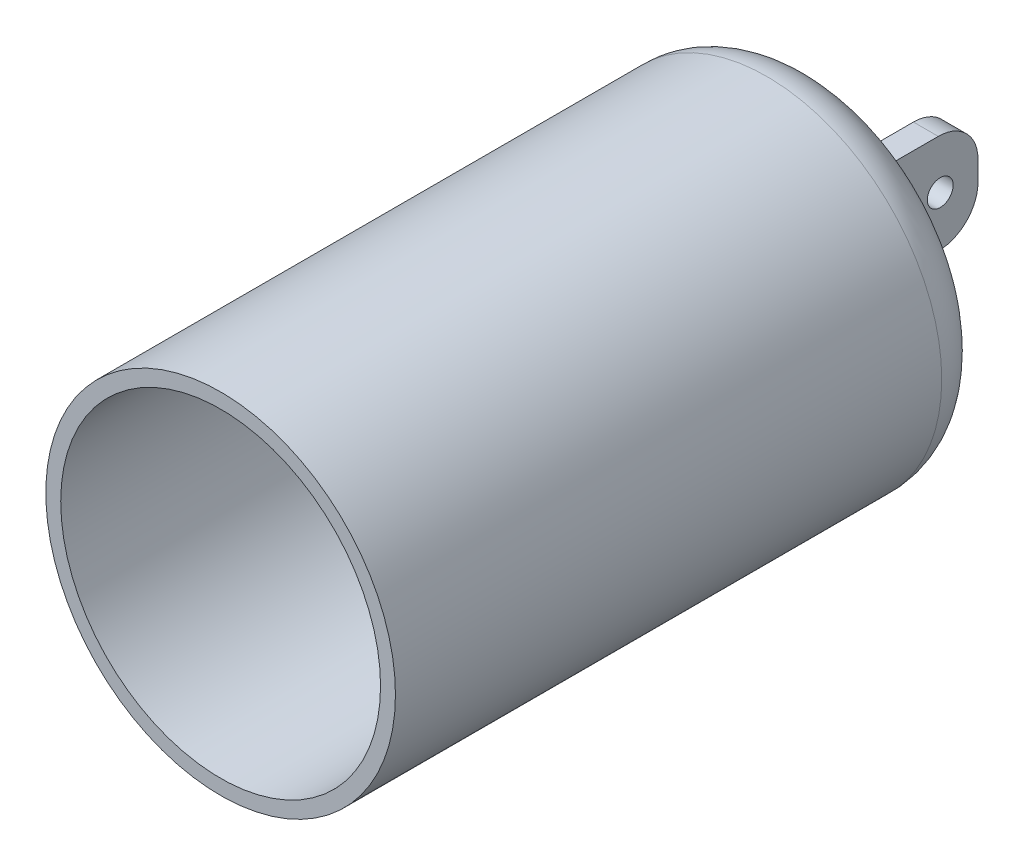
ISO-10303-21;
HEADER;
FILE_DESCRIPTION(('STEP AP214'),'2;1');
FILE_NAME('part.step','',(''),(''),'','','');
FILE_SCHEMA(('AUTOMOTIVE_DESIGN { 1 0 10303 214 1 1 1 1 }'));
ENDSEC;
DATA;
#1=APPLICATION_CONTEXT('core data for automotive mechanical design processes');
#2=APPLICATION_PROTOCOL_DEFINITION('international standard','automotive_design',2000,#1);
#3=PRODUCT_CONTEXT('',#1,'mechanical');
#4=PRODUCT('Part','Part','',(#3));
#5=PRODUCT_RELATED_PRODUCT_CATEGORY('part','',(#4));
#6=PRODUCT_DEFINITION_FORMATION('','',#4);
#7=PRODUCT_DEFINITION_CONTEXT('part definition',#1,'design');
#8=PRODUCT_DEFINITION('design','',#6,#7);
#9=PRODUCT_DEFINITION_SHAPE('','',#8);
#10=(LENGTH_UNIT() NAMED_UNIT(*) SI_UNIT(.MILLI.,.METRE.));
#11=(NAMED_UNIT(*) PLANE_ANGLE_UNIT() SI_UNIT($,.RADIAN.));
#12=(NAMED_UNIT(*) SI_UNIT($,.STERADIAN.) SOLID_ANGLE_UNIT());
#13=UNCERTAINTY_MEASURE_WITH_UNIT(LENGTH_MEASURE(1.E-05),#10,'distance_accuracy_value','');
#14=(GEOMETRIC_REPRESENTATION_CONTEXT(3) GLOBAL_UNCERTAINTY_ASSIGNED_CONTEXT((#13)) GLOBAL_UNIT_ASSIGNED_CONTEXT((#10,
#11,#12)) REPRESENTATION_CONTEXT('',''));
#15=CARTESIAN_POINT('',(0.,0.,0.));
#16=DIRECTION('',(0.,0.,1.));
#17=DIRECTION('',(1.,0.,0.));
#18=AXIS2_PLACEMENT_3D('',#15,#16,#17);
#19=CARTESIAN_POINT('',(0.,0.,0.));
#20=DIRECTION('',(0.,0.,1.));
#21=DIRECTION('',(1.,0.,0.));
#22=AXIS2_PLACEMENT_3D('',#19,#20,#21);
#23=PLANE('',#22);
#24=CARTESIAN_POINT('',(0.,0.,0.));
#25=DIRECTION('',(0.,0.,1.));
#26=DIRECTION('',(1.,0.,0.));
#27=AXIS2_PLACEMENT_3D('',#24,#25,#26);
#28=CIRCLE('',#27,126.);
#29=CARTESIAN_POINT('',(126.,0.,0.));
#30=VERTEX_POINT('',#29);
#31=EDGE_CURVE('E11',#30,#30,#28,.F.);
#32=ORIENTED_EDGE('',*,*,#31,.T.);
#33=EDGE_LOOP('',(#32));
#34=FACE_BOUND('',#33,.T.);
#35=DIRECTION('',(1.,0.,0.));
#36=VECTOR('',#35,1.);
#37=CARTESIAN_POINT('',(-12.5,70.,0.));
#38=LINE('',#37,#36);
#39=CARTESIAN_POINT('',(32.5,70.,0.));
#40=VERTEX_POINT('',#39);
#41=CARTESIAN_POINT('',(-32.5,70.,0.));
#42=VERTEX_POINT('',#41);
#43=EDGE_CURVE('E213',#40,#42,#38,.F.);
#44=ORIENTED_EDGE('',*,*,#43,.T.);
#45=DIRECTION('',(0.,1.,0.));
#46=VECTOR('',#45,1.);
#47=CARTESIAN_POINT('',(-32.5,-50.,0.));
#48=LINE('',#47,#46);
#49=CARTESIAN_POINT('',(-32.5,-70.,0.));
#50=VERTEX_POINT('',#49);
#51=EDGE_CURVE('E219',#42,#50,#48,.F.);
#52=ORIENTED_EDGE('',*,*,#51,.T.);
#53=DIRECTION('',(-1.,0.,0.));
#54=VECTOR('',#53,1.);
#55=CARTESIAN_POINT('',(12.5,-70.,0.));
#56=LINE('',#55,#54);
#57=CARTESIAN_POINT('',(32.5,-70.,0.));
#58=VERTEX_POINT('',#57);
#59=EDGE_CURVE('E217',#50,#58,#56,.F.);
#60=ORIENTED_EDGE('',*,*,#59,.T.);
#61=DIRECTION('',(0.,-1.,0.));
#62=VECTOR('',#61,1.);
#63=CARTESIAN_POINT('',(32.5,50.,0.));
#64=LINE('',#63,#62);
#65=EDGE_CURVE('E215',#58,#40,#64,.F.);
#66=ORIENTED_EDGE('',*,*,#65,.T.);
#67=EDGE_LOOP('',(#44,#52,#60,#66));
#68=FACE_BOUND('',#67,.T.);
#69=ADVANCED_FACE('F39',(#34,#68),#23,.F.);
#70=CARTESIAN_POINT('',(0.,0.,600.));
#71=DIRECTION('',(0.,0.,-1.));
#72=DIRECTION('',(-1.,0.,0.));
#73=AXIS2_PLACEMENT_3D('',#70,#71,#72);
#74=CYLINDRICAL_SURFACE('',#73,176.);
#75=CARTESIAN_POINT('',(0.,0.,50.));
#76=DIRECTION('',(0.,0.,1.));
#77=DIRECTION('',(1.,0.,0.));
#78=AXIS2_PLACEMENT_3D('',#75,#76,#77);
#79=CIRCLE('',#78,176.);
#80=CARTESIAN_POINT('',(176.,0.,50.));
#81=VERTEX_POINT('',#80);
#82=EDGE_CURVE('E47',#81,#81,#79,.T.);
#83=ORIENTED_EDGE('',*,*,#82,.T.);
#84=EDGE_LOOP('',(#83));
#85=FACE_BOUND('',#84,.T.);
#86=CARTESIAN_POINT('',(0.,0.,600.));
#87=DIRECTION('',(0.,0.,1.));
#88=DIRECTION('',(1.,0.,0.));
#89=AXIS2_PLACEMENT_3D('',#86,#87,#88);
#90=CIRCLE('',#89,176.);
#91=CARTESIAN_POINT('',(176.,0.,600.));
#92=VERTEX_POINT('',#91);
#93=EDGE_CURVE('E187',#92,#92,#90,.T.);
#94=ORIENTED_EDGE('',*,*,#93,.F.);
#95=EDGE_LOOP('',(#94));
#96=FACE_BOUND('',#95,.T.);
#97=ADVANCED_FACE('F236',(#85,#96),#74,.T.);
#98=CARTESIAN_POINT('',(0.,0.,600.));
#99=DIRECTION('',(0.,0.,1.));
#100=DIRECTION('',(1.,0.,0.));
#101=AXIS2_PLACEMENT_3D('',#98,#99,#100);
#102=PLANE('',#101);
#103=CARTESIAN_POINT('',(0.,0.,600.));
#104=DIRECTION('',(0.,0.,1.));
#105=DIRECTION('',(1.,0.,0.));
#106=AXIS2_PLACEMENT_3D('',#103,#104,#105);
#107=CIRCLE('',#106,161.);
#108=CARTESIAN_POINT('',(161.,0.,600.));
#109=VERTEX_POINT('',#108);
#110=EDGE_CURVE('E144',#109,#109,#107,.T.);
#111=ORIENTED_EDGE('',*,*,#110,.F.);
#112=EDGE_LOOP('',(#111));
#113=FACE_BOUND('',#112,.T.);
#114=ORIENTED_EDGE('',*,*,#93,.T.);
#115=EDGE_LOOP('',(#114));
#116=FACE_BOUND('',#115,.T.);
#117=ADVANCED_FACE('F259',(#113,#116),#102,.T.);
#118=CARTESIAN_POINT('',(12.5,-50.,-150.));
#119=DIRECTION('',(-1.,0.,0.));
#120=DIRECTION('',(0.,0.,1.));
#121=AXIS2_PLACEMENT_3D('',#118,#119,#120);
#122=PLANE('',#121);
#123=CARTESIAN_POINT('',(12.5,0.,-112.));
#124=DIRECTION('',(1.,0.,0.));
#125=DIRECTION('',(0.,0.,-1.));
#126=AXIS2_PLACEMENT_3D('',#123,#124,#125);
#127=CIRCLE('',#126,13.);
#128=CARTESIAN_POINT('',(12.5,0.,-125.));
#129=VERTEX_POINT('',#128);
#130=EDGE_CURVE('E167',#129,#129,#127,.T.);
#131=ORIENTED_EDGE('',*,*,#130,.F.);
#132=EDGE_LOOP('',(#131));
#133=FACE_BOUND('',#132,.T.);
#134=DIRECTION('',(0.,0.,1.));
#135=VECTOR('',#134,1.);
#136=CARTESIAN_POINT('',(12.5,50.,-150.));
#137=LINE('',#136,#135);
#138=CARTESIAN_POINT('',(12.5,50.,-110.));
#139=VERTEX_POINT('',#138);
#140=CARTESIAN_POINT('',(12.5,50.,-20.));
#141=VERTEX_POINT('',#140);
#142=EDGE_CURVE('E178',#139,#141,#137,.T.);
#143=ORIENTED_EDGE('',*,*,#142,.T.);
#144=DIRECTION('',(0.,-1.,0.));
#145=VECTOR('',#144,1.);
#146=CARTESIAN_POINT('',(12.5,-50.,-20.));
#147=LINE('',#146,#145);
#148=CARTESIAN_POINT('',(12.5,-50.,-20.));
#149=VERTEX_POINT('',#148);
#150=EDGE_CURVE('E61',#141,#149,#147,.T.);
#151=ORIENTED_EDGE('',*,*,#150,.T.);
#152=DIRECTION('',(0.,0.,1.));
#153=VECTOR('',#152,1.);
#154=CARTESIAN_POINT('',(12.5,-50.,-150.));
#155=LINE('',#154,#153);
#156=CARTESIAN_POINT('',(12.5,-50.,-110.));
#157=VERTEX_POINT('',#156);
#158=EDGE_CURVE('E185',#157,#149,#155,.T.);
#159=ORIENTED_EDGE('',*,*,#158,.F.);
#160=CARTESIAN_POINT('',(12.5,-10.,-110.));
#161=DIRECTION('',(-1.,0.,0.));
#162=DIRECTION('',(0.,0.,1.));
#163=AXIS2_PLACEMENT_3D('',#160,#161,#162);
#164=CIRCLE('',#163,40.);
#165=CARTESIAN_POINT('',(12.5,-10.,-150.));
#166=VERTEX_POINT('',#165);
#167=EDGE_CURVE('E198',#157,#166,#164,.F.);
#168=ORIENTED_EDGE('',*,*,#167,.T.);
#169=DIRECTION('',(0.,-1.,0.));
#170=VECTOR('',#169,1.);
#171=CARTESIAN_POINT('',(12.5,-50.,-150.));
#172=LINE('',#171,#170);
#173=CARTESIAN_POINT('',(12.5,10.,-150.));
#174=VERTEX_POINT('',#173);
#175=EDGE_CURVE('E172',#174,#166,#172,.T.);
#176=ORIENTED_EDGE('',*,*,#175,.F.);
#177=CARTESIAN_POINT('',(12.5,10.,-110.));
#178=DIRECTION('',(-1.,0.,0.));
#179=DIRECTION('',(0.,0.,1.));
#180=AXIS2_PLACEMENT_3D('',#177,#178,#179);
#181=CIRCLE('',#180,40.);
#182=EDGE_CURVE('E200',#174,#139,#181,.F.);
#183=ORIENTED_EDGE('',*,*,#182,.T.);
#184=EDGE_LOOP('',(#143,#151,#159,#168,#176,#183));
#185=FACE_BOUND('',#184,.T.);
#186=ADVANCED_FACE('F309',(#133,#185),#122,.F.);
#187=CARTESIAN_POINT('',(-12.5,-50.,-150.));
#188=DIRECTION('',(0.,1.,0.));
#189=DIRECTION('',(0.,0.,1.));
#190=AXIS2_PLACEMENT_3D('',#187,#188,#189);
#191=PLANE('',#190);
#192=ORIENTED_EDGE('',*,*,#158,.T.);
#193=DIRECTION('',(-1.,0.,0.));
#194=VECTOR('',#193,1.);
#195=CARTESIAN_POINT('',(-12.5,-50.,-20.));
#196=LINE('',#195,#194);
#197=CARTESIAN_POINT('',(-12.5,-50.,-20.));
#198=VERTEX_POINT('',#197);
#199=EDGE_CURVE('E222',#149,#198,#196,.T.);
#200=ORIENTED_EDGE('',*,*,#199,.T.);
#201=DIRECTION('',(0.,0.,1.));
#202=VECTOR('',#201,1.);
#203=CARTESIAN_POINT('',(-12.5,-50.,-150.));
#204=LINE('',#203,#202);
#205=CARTESIAN_POINT('',(-12.5,-50.,-110.));
#206=VERTEX_POINT('',#205);
#207=EDGE_CURVE('E182',#206,#198,#204,.T.);
#208=ORIENTED_EDGE('',*,*,#207,.F.);
#209=DIRECTION('',(-1.,0.,0.));
#210=VECTOR('',#209,1.);
#211=CARTESIAN_POINT('',(12.5,-50.,-110.));
#212=LINE('',#211,#210);
#213=EDGE_CURVE('E208',#206,#157,#212,.F.);
#214=ORIENTED_EDGE('',*,*,#213,.T.);
#215=EDGE_LOOP('',(#192,#200,#208,#214));
#216=FACE_BOUND('',#215,.T.);
#217=ADVANCED_FACE('F297',(#216),#191,.F.);
#218=CARTESIAN_POINT('',(-12.5,-50.,-150.));
#219=DIRECTION('',(1.,0.,0.));
#220=DIRECTION('',(0.,0.,-1.));
#221=AXIS2_PLACEMENT_3D('',#218,#219,#220);
#222=PLANE('',#221);
#223=CARTESIAN_POINT('',(-12.5,0.,-112.));
#224=DIRECTION('',(1.,0.,0.));
#225=DIRECTION('',(0.,0.,-1.));
#226=AXIS2_PLACEMENT_3D('',#223,#224,#225);
#227=CIRCLE('',#226,13.);
#228=CARTESIAN_POINT('',(-12.5,0.,-125.));
#229=VERTEX_POINT('',#228);
#230=EDGE_CURVE('E170',#229,#229,#227,.T.);
#231=ORIENTED_EDGE('',*,*,#230,.T.);
#232=EDGE_LOOP('',(#231));
#233=FACE_BOUND('',#232,.T.);
#234=ORIENTED_EDGE('',*,*,#207,.T.);
#235=DIRECTION('',(0.,1.,0.));
#236=VECTOR('',#235,1.);
#237=CARTESIAN_POINT('',(-12.5,50.,-20.));
#238=LINE('',#237,#236);
#239=CARTESIAN_POINT('',(-12.5,50.,-20.));
#240=VERTEX_POINT('',#239);
#241=EDGE_CURVE('E210',#198,#240,#238,.T.);
#242=ORIENTED_EDGE('',*,*,#241,.T.);
#243=DIRECTION('',(0.,0.,1.));
#244=VECTOR('',#243,1.);
#245=CARTESIAN_POINT('',(-12.5,50.,-150.));
#246=LINE('',#245,#244);
#247=CARTESIAN_POINT('',(-12.5,50.,-110.));
#248=VERTEX_POINT('',#247);
#249=EDGE_CURVE('E180',#248,#240,#246,.T.);
#250=ORIENTED_EDGE('',*,*,#249,.F.);
#251=CARTESIAN_POINT('',(-12.5,10.,-110.));
#252=DIRECTION('',(1.,0.,0.));
#253=DIRECTION('',(0.,0.,-1.));
#254=AXIS2_PLACEMENT_3D('',#251,#252,#253);
#255=CIRCLE('',#254,40.);
#256=CARTESIAN_POINT('',(-12.5,10.,-150.));
#257=VERTEX_POINT('',#256);
#258=EDGE_CURVE('E206',#248,#257,#255,.F.);
#259=ORIENTED_EDGE('',*,*,#258,.T.);
#260=DIRECTION('',(0.,1.,0.));
#261=VECTOR('',#260,1.);
#262=CARTESIAN_POINT('',(-12.5,-50.,-150.));
#263=LINE('',#262,#261);
#264=CARTESIAN_POINT('',(-12.5,-10.,-150.));
#265=VERTEX_POINT('',#264);
#266=EDGE_CURVE('E175',#265,#257,#263,.T.);
#267=ORIENTED_EDGE('',*,*,#266,.F.);
#268=CARTESIAN_POINT('',(-12.5,-10.,-110.));
#269=DIRECTION('',(1.,0.,0.));
#270=DIRECTION('',(0.,0.,-1.));
#271=AXIS2_PLACEMENT_3D('',#268,#269,#270);
#272=CIRCLE('',#271,40.);
#273=EDGE_CURVE('E204',#265,#206,#272,.F.);
#274=ORIENTED_EDGE('',*,*,#273,.T.);
#275=EDGE_LOOP('',(#234,#242,#250,#259,#267,#274));
#276=FACE_BOUND('',#275,.T.);
#277=ADVANCED_FACE('F300',(#233,#276),#222,.F.);
#278=CARTESIAN_POINT('',(-12.5,50.,-150.));
#279=DIRECTION('',(0.,-1.,0.));
#280=DIRECTION('',(0.,0.,-1.));
#281=AXIS2_PLACEMENT_3D('',#278,#279,#280);
#282=PLANE('',#281);
#283=ORIENTED_EDGE('',*,*,#249,.T.);
#284=DIRECTION('',(1.,0.,0.));
#285=VECTOR('',#284,1.);
#286=CARTESIAN_POINT('',(12.5,50.,-20.));
#287=LINE('',#286,#285);
#288=EDGE_CURVE('E54',#240,#141,#287,.T.);
#289=ORIENTED_EDGE('',*,*,#288,.T.);
#290=ORIENTED_EDGE('',*,*,#142,.F.);
#291=DIRECTION('',(1.,0.,0.));
#292=VECTOR('',#291,1.);
#293=CARTESIAN_POINT('',(-12.5,50.,-110.));
#294=LINE('',#293,#292);
#295=EDGE_CURVE('E202',#139,#248,#294,.F.);
#296=ORIENTED_EDGE('',*,*,#295,.T.);
#297=EDGE_LOOP('',(#283,#289,#290,#296));
#298=FACE_BOUND('',#297,.T.);
#299=ADVANCED_FACE('F311',(#298),#282,.F.);
#300=CARTESIAN_POINT('',(0.,0.,-150.));
#301=DIRECTION('',(0.,0.,-1.));
#302=DIRECTION('',(-1.,0.,0.));
#303=AXIS2_PLACEMENT_3D('',#300,#301,#302);
#304=PLANE('',#303);
#305=ORIENTED_EDGE('',*,*,#266,.T.);
#306=DIRECTION('',(1.,0.,0.));
#307=VECTOR('',#306,1.);
#308=CARTESIAN_POINT('',(12.5,10.,-150.));
#309=LINE('',#308,#307);
#310=EDGE_CURVE('E195',#257,#174,#309,.T.);
#311=ORIENTED_EDGE('',*,*,#310,.T.);
#312=ORIENTED_EDGE('',*,*,#175,.T.);
#313=DIRECTION('',(-1.,0.,0.));
#314=VECTOR('',#313,1.);
#315=CARTESIAN_POINT('',(-12.5,-10.,-150.));
#316=LINE('',#315,#314);
#317=EDGE_CURVE('E190',#166,#265,#316,.T.);
#318=ORIENTED_EDGE('',*,*,#317,.T.);
#319=EDGE_LOOP('',(#305,#311,#312,#318));
#320=FACE_BOUND('',#319,.T.);
#321=ADVANCED_FACE('F306',(#320),#304,.T.);
#322=CARTESIAN_POINT('',(-176.,0.,-112.));
#323=DIRECTION('',(1.,0.,0.));
#324=DIRECTION('',(0.,0.,-1.));
#325=AXIS2_PLACEMENT_3D('',#322,#323,#324);
#326=CYLINDRICAL_SURFACE('',#325,13.);
#327=ORIENTED_EDGE('',*,*,#130,.T.);
#328=EDGE_LOOP('',(#327));
#329=FACE_BOUND('',#328,.T.);
#330=ORIENTED_EDGE('',*,*,#230,.F.);
#331=EDGE_LOOP('',(#330));
#332=FACE_BOUND('',#331,.T.);
#333=ADVANCED_FACE('F269',(#329,#332),#326,.F.);
#334=CARTESIAN_POINT('',(0.,10.,-110.));
#335=DIRECTION('',(-1.,0.,0.));
#336=DIRECTION('',(0.,0.,1.));
#337=AXIS2_PLACEMENT_3D('',#334,#335,#336);
#338=CYLINDRICAL_SURFACE('',#337,40.);
#339=ORIENTED_EDGE('',*,*,#258,.F.);
#340=ORIENTED_EDGE('',*,*,#295,.F.);
#341=ORIENTED_EDGE('',*,*,#182,.F.);
#342=ORIENTED_EDGE('',*,*,#310,.F.);
#343=EDGE_LOOP('',(#339,#340,#341,#342));
#344=FACE_BOUND('',#343,.T.);
#345=ADVANCED_FACE('F265',(#344),#338,.T.);
#346=CARTESIAN_POINT('',(0.,-10.,-110.));
#347=DIRECTION('',(1.,0.,0.));
#348=DIRECTION('',(0.,0.,-1.));
#349=AXIS2_PLACEMENT_3D('',#346,#347,#348);
#350=CYLINDRICAL_SURFACE('',#349,40.);
#351=ORIENTED_EDGE('',*,*,#167,.F.);
#352=ORIENTED_EDGE('',*,*,#213,.F.);
#353=ORIENTED_EDGE('',*,*,#273,.F.);
#354=ORIENTED_EDGE('',*,*,#317,.F.);
#355=EDGE_LOOP('',(#351,#352,#353,#354));
#356=FACE_BOUND('',#355,.T.);
#357=ADVANCED_FACE('F268',(#356),#350,.T.);
#358=CARTESIAN_POINT('',(32.5,-50.,-20.));
#359=DIRECTION('',(0.,1.,0.));
#360=DIRECTION('',(0.,0.,1.));
#361=AXIS2_PLACEMENT_3D('',#358,#359,#360);
#362=CYLINDRICAL_SURFACE('',#361,20.);
#363=CARTESIAN_POINT('',(32.5,70.,-20.));
#364=DIRECTION('',(-0.707106781186547,0.707106781186547,0.));
#365=DIRECTION('',(-0.707106781186547,-0.707106781186547,0.));
#366=AXIS2_PLACEMENT_3D('',#363,#364,#365);
#367=ELLIPSE('',#366,28.2842712474619,20.);
#368=EDGE_CURVE('E229',#40,#141,#367,.F.);
#369=ORIENTED_EDGE('',*,*,#368,.F.);
#370=ORIENTED_EDGE('',*,*,#65,.F.);
#371=CARTESIAN_POINT('',(32.5,-70.,-20.));
#372=DIRECTION('',(0.707106781186547,0.707106781186547,0.));
#373=DIRECTION('',(-0.707106781186547,0.707106781186547,0.));
#374=AXIS2_PLACEMENT_3D('',#371,#372,#373);
#375=ELLIPSE('',#374,28.2842712474619,20.);
#376=EDGE_CURVE('E171',#149,#58,#375,.T.);
#377=ORIENTED_EDGE('',*,*,#376,.F.);
#378=ORIENTED_EDGE('',*,*,#150,.F.);
#379=EDGE_LOOP('',(#369,#370,#377,#378));
#380=FACE_BOUND('',#379,.T.);
#381=ADVANCED_FACE('F272',(#380),#362,.F.);
#382=CARTESIAN_POINT('',(-12.5,-70.,-20.));
#383=DIRECTION('',(1.,0.,0.));
#384=DIRECTION('',(0.,0.,-1.));
#385=AXIS2_PLACEMENT_3D('',#382,#383,#384);
#386=CYLINDRICAL_SURFACE('',#385,20.);
#387=ORIENTED_EDGE('',*,*,#376,.T.);
#388=ORIENTED_EDGE('',*,*,#59,.F.);
#389=CARTESIAN_POINT('',(-32.5,-70.,-20.));
#390=DIRECTION('',(0.707106781186547,-0.707106781186547,0.));
#391=DIRECTION('',(0.707106781186547,0.707106781186547,0.));
#392=AXIS2_PLACEMENT_3D('',#389,#390,#391);
#393=ELLIPSE('',#392,28.2842712474619,20.);
#394=EDGE_CURVE('E227',#198,#50,#393,.T.);
#395=ORIENTED_EDGE('',*,*,#394,.F.);
#396=ORIENTED_EDGE('',*,*,#199,.F.);
#397=EDGE_LOOP('',(#387,#388,#395,#396));
#398=FACE_BOUND('',#397,.T.);
#399=ADVANCED_FACE('F277',(#398),#386,.F.);
#400=CARTESIAN_POINT('',(-12.5,70.,-20.));
#401=DIRECTION('',(-1.,0.,0.));
#402=DIRECTION('',(0.,0.,1.));
#403=AXIS2_PLACEMENT_3D('',#400,#401,#402);
#404=CYLINDRICAL_SURFACE('',#403,20.);
#405=ORIENTED_EDGE('',*,*,#368,.T.);
#406=ORIENTED_EDGE('',*,*,#288,.F.);
#407=CARTESIAN_POINT('',(-32.5,70.,-20.));
#408=DIRECTION('',(-0.707106781186547,-0.707106781186547,0.));
#409=DIRECTION('',(-0.707106781186547,0.707106781186547,0.));
#410=AXIS2_PLACEMENT_3D('',#407,#408,#409);
#411=ELLIPSE('',#410,28.2842712474619,20.);
#412=EDGE_CURVE('E166',#42,#240,#411,.F.);
#413=ORIENTED_EDGE('',*,*,#412,.F.);
#414=ORIENTED_EDGE('',*,*,#43,.F.);
#415=EDGE_LOOP('',(#405,#406,#413,#414));
#416=FACE_BOUND('',#415,.T.);
#417=ADVANCED_FACE('F249',(#416),#404,.F.);
#418=CARTESIAN_POINT('',(-32.5,-50.,-20.));
#419=DIRECTION('',(0.,-1.,0.));
#420=DIRECTION('',(0.,0.,-1.));
#421=AXIS2_PLACEMENT_3D('',#418,#419,#420);
#422=CYLINDRICAL_SURFACE('',#421,20.);
#423=ORIENTED_EDGE('',*,*,#394,.T.);
#424=ORIENTED_EDGE('',*,*,#51,.F.);
#425=ORIENTED_EDGE('',*,*,#412,.T.);
#426=ORIENTED_EDGE('',*,*,#241,.F.);
#427=EDGE_LOOP('',(#423,#424,#425,#426));
#428=FACE_BOUND('',#427,.T.);
#429=ADVANCED_FACE('F240',(#428),#422,.F.);
#430=CARTESIAN_POINT('',(0.,0.,50.));
#431=DIRECTION('',(0.,0.,1.));
#432=DIRECTION('',(1.,0.,0.));
#433=AXIS2_PLACEMENT_3D('',#430,#431,#432);
#434=TOROIDAL_SURFACE('',#433,126.,50.);
#435=ORIENTED_EDGE('',*,*,#31,.F.);
#436=EDGE_LOOP('',(#435));
#437=FACE_BOUND('',#436,.T.);
#438=ORIENTED_EDGE('',*,*,#82,.F.);
#439=EDGE_LOOP('',(#438));
#440=FACE_BOUND('',#439,.T.);
#441=ADVANCED_FACE('F41',(#437,#440),#434,.T.);
#442=CARTESIAN_POINT('',(0.,0.,15.));
#443=DIRECTION('',(0.,0.,1.));
#444=DIRECTION('',(1.,0.,0.));
#445=AXIS2_PLACEMENT_3D('',#442,#443,#444);
#446=PLANE('',#445);
#447=CARTESIAN_POINT('',(0.,0.,15.));
#448=DIRECTION('',(0.,0.,1.));
#449=DIRECTION('',(1.,0.,0.));
#450=AXIS2_PLACEMENT_3D('',#447,#448,#449);
#451=CIRCLE('',#450,126.);
#452=CARTESIAN_POINT('',(126.,0.,15.));
#453=VERTEX_POINT('',#452);
#454=EDGE_CURVE('E153',#453,#453,#451,.F.);
#455=ORIENTED_EDGE('',*,*,#454,.F.);
#456=EDGE_LOOP('',(#455));
#457=FACE_BOUND('',#456,.T.);
#458=DIRECTION('',(1.,0.,0.));
#459=VECTOR('',#458,1.);
#460=CARTESIAN_POINT('',(0.,70.,15.));
#461=LINE('',#460,#459);
#462=CARTESIAN_POINT('',(32.5,70.,15.));
#463=VERTEX_POINT('',#462);
#464=CARTESIAN_POINT('',(-32.5,70.,15.));
#465=VERTEX_POINT('',#464);
#466=EDGE_CURVE('E138',#463,#465,#461,.F.);
#467=ORIENTED_EDGE('',*,*,#466,.F.);
#468=DIRECTION('',(0.,1.,0.));
#469=VECTOR('',#468,1.);
#470=CARTESIAN_POINT('',(32.5,0.,15.));
#471=LINE('',#470,#469);
#472=CARTESIAN_POINT('',(32.5,-70.,15.));
#473=VERTEX_POINT('',#472);
#474=EDGE_CURVE('E143',#473,#463,#471,.T.);
#475=ORIENTED_EDGE('',*,*,#474,.F.);
#476=DIRECTION('',(1.,0.,0.));
#477=VECTOR('',#476,1.);
#478=CARTESIAN_POINT('',(0.,-70.,15.));
#479=LINE('',#478,#477);
#480=CARTESIAN_POINT('',(-32.5,-70.,15.));
#481=VERTEX_POINT('',#480);
#482=EDGE_CURVE('E149',#481,#473,#479,.T.);
#483=ORIENTED_EDGE('',*,*,#482,.F.);
#484=DIRECTION('',(0.,1.,0.));
#485=VECTOR('',#484,1.);
#486=CARTESIAN_POINT('',(-32.5,0.,15.));
#487=LINE('',#486,#485);
#488=EDGE_CURVE('E130',#465,#481,#487,.F.);
#489=ORIENTED_EDGE('',*,*,#488,.F.);
#490=EDGE_LOOP('',(#467,#475,#483,#489));
#491=FACE_BOUND('',#490,.T.);
#492=ADVANCED_FACE('F147',(#457,#491),#446,.T.);
#493=CARTESIAN_POINT('',(0.,0.,600.));
#494=DIRECTION('',(0.,0.,-1.));
#495=DIRECTION('',(-1.,0.,0.));
#496=AXIS2_PLACEMENT_3D('',#493,#494,#495);
#497=CYLINDRICAL_SURFACE('',#496,161.);
#498=CARTESIAN_POINT('',(0.,0.,50.));
#499=DIRECTION('',(0.,0.,-1.));
#500=DIRECTION('',(-1.,0.,0.));
#501=AXIS2_PLACEMENT_3D('',#498,#499,#500);
#502=CIRCLE('',#501,161.);
#503=CARTESIAN_POINT('',(-161.,0.,50.));
#504=VERTEX_POINT('',#503);
#505=EDGE_CURVE('E150',#504,#504,#502,.F.);
#506=ORIENTED_EDGE('',*,*,#505,.F.);
#507=EDGE_LOOP('',(#506));
#508=FACE_BOUND('',#507,.T.);
#509=ORIENTED_EDGE('',*,*,#110,.T.);
#510=EDGE_LOOP('',(#509));
#511=FACE_BOUND('',#510,.T.);
#512=ADVANCED_FACE('F246',(#508,#511),#497,.F.);
#513=CARTESIAN_POINT('',(32.5,-50.,-20.));
#514=DIRECTION('',(0.,1.,0.));
#515=DIRECTION('',(0.,0.,1.));
#516=AXIS2_PLACEMENT_3D('',#513,#514,#515);
#517=CYLINDRICAL_SURFACE('',#516,35.);
#518=CARTESIAN_POINT('',(32.5,-70.,-20.));
#519=DIRECTION('',(0.707106781186547,0.707106781186547,0.));
#520=DIRECTION('',(0.707106781186547,-0.707106781186547,0.));
#521=AXIS2_PLACEMENT_3D('',#518,#519,#520);
#522=ELLIPSE('',#521,49.4974746830583,35.);
#523=CARTESIAN_POINT('',(0.,-37.5,-7.00961894323341));
#524=VERTEX_POINT('',#523);
#525=EDGE_CURVE('E160',#524,#473,#522,.T.);
#526=ORIENTED_EDGE('',*,*,#525,.T.);
#527=ORIENTED_EDGE('',*,*,#474,.T.);
#528=CARTESIAN_POINT('',(32.5,70.,-20.));
#529=DIRECTION('',(-0.707106781186547,0.707106781186547,0.));
#530=DIRECTION('',(-0.707106781186547,-0.707106781186547,0.));
#531=AXIS2_PLACEMENT_3D('',#528,#529,#530);
#532=ELLIPSE('',#531,49.4974746830583,35.);
#533=CARTESIAN_POINT('',(0.,37.5,-7.00961894323341));
#534=VERTEX_POINT('',#533);
#535=EDGE_CURVE('E140',#463,#534,#532,.F.);
#536=ORIENTED_EDGE('',*,*,#535,.T.);
#537=DIRECTION('',(0.,1.,0.));
#538=VECTOR('',#537,1.);
#539=CARTESIAN_POINT('',(0.,-50.,-7.00961894323341));
#540=LINE('',#539,#538);
#541=EDGE_CURVE('E131',#524,#534,#540,.T.);
#542=ORIENTED_EDGE('',*,*,#541,.F.);
#543=EDGE_LOOP('',(#526,#527,#536,#542));
#544=FACE_BOUND('',#543,.T.);
#545=ADVANCED_FACE('F350',(#544),#517,.T.);
#546=CARTESIAN_POINT('',(-12.5,-70.,-20.));
#547=DIRECTION('',(1.,0.,0.));
#548=DIRECTION('',(0.,0.,-1.));
#549=AXIS2_PLACEMENT_3D('',#546,#547,#548);
#550=CYLINDRICAL_SURFACE('',#549,35.);
#551=CARTESIAN_POINT('',(-32.5,-70.,-20.));
#552=DIRECTION('',(0.707106781186547,-0.707106781186547,0.));
#553=DIRECTION('',(-0.707106781186547,-0.707106781186547,0.));
#554=AXIS2_PLACEMENT_3D('',#551,#552,#553);
#555=ELLIPSE('',#554,49.4974746830583,35.);
#556=EDGE_CURVE('E135',#524,#481,#555,.T.);
#557=ORIENTED_EDGE('',*,*,#556,.T.);
#558=ORIENTED_EDGE('',*,*,#482,.T.);
#559=ORIENTED_EDGE('',*,*,#525,.F.);
#560=EDGE_LOOP('',(#557,#558,#559));
#561=FACE_BOUND('',#560,.T.);
#562=ADVANCED_FACE('F347',(#561),#550,.T.);
#563=CARTESIAN_POINT('',(-12.5,70.,-20.));
#564=DIRECTION('',(-1.,0.,0.));
#565=DIRECTION('',(0.,0.,1.));
#566=AXIS2_PLACEMENT_3D('',#563,#564,#565);
#567=CYLINDRICAL_SURFACE('',#566,35.);
#568=ORIENTED_EDGE('',*,*,#535,.F.);
#569=ORIENTED_EDGE('',*,*,#466,.T.);
#570=CARTESIAN_POINT('',(-32.5,70.,-20.));
#571=DIRECTION('',(-0.707106781186547,-0.707106781186547,0.));
#572=DIRECTION('',(0.707106781186547,-0.707106781186547,0.));
#573=AXIS2_PLACEMENT_3D('',#570,#571,#572);
#574=ELLIPSE('',#573,49.4974746830583,35.);
#575=EDGE_CURVE('E125',#465,#534,#574,.F.);
#576=ORIENTED_EDGE('',*,*,#575,.T.);
#577=EDGE_LOOP('',(#568,#569,#576));
#578=FACE_BOUND('',#577,.T.);
#579=ADVANCED_FACE('F139',(#578),#567,.T.);
#580=CARTESIAN_POINT('',(-32.5,-50.,-20.));
#581=DIRECTION('',(0.,-1.,0.));
#582=DIRECTION('',(0.,0.,-1.));
#583=AXIS2_PLACEMENT_3D('',#580,#581,#582);
#584=CYLINDRICAL_SURFACE('',#583,35.);
#585=ORIENTED_EDGE('',*,*,#541,.T.);
#586=ORIENTED_EDGE('',*,*,#575,.F.);
#587=ORIENTED_EDGE('',*,*,#488,.T.);
#588=ORIENTED_EDGE('',*,*,#556,.F.);
#589=EDGE_LOOP('',(#585,#586,#587,#588));
#590=FACE_BOUND('',#589,.T.);
#591=ADVANCED_FACE('F127',(#590),#584,.T.);
#592=CARTESIAN_POINT('',(0.,0.,50.));
#593=DIRECTION('',(0.,0.,1.));
#594=DIRECTION('',(1.,0.,0.));
#595=AXIS2_PLACEMENT_3D('',#592,#593,#594);
#596=TOROIDAL_SURFACE('',#595,126.,35.);
#597=ORIENTED_EDGE('',*,*,#454,.T.);
#598=EDGE_LOOP('',(#597));
#599=FACE_BOUND('',#598,.T.);
#600=ORIENTED_EDGE('',*,*,#505,.T.);
#601=EDGE_LOOP('',(#600));
#602=FACE_BOUND('',#601,.T.);
#603=ADVANCED_FACE('F339',(#599,#602),#596,.F.);
#604=CLOSED_SHELL('',(#69,#97,#117,#186,#217,#277,#299,#321,#333,#345,#357,#381,#399,#417,#429,
#441,#492,#512,#545,#562,#579,#591,#603));
#605=MANIFOLD_SOLID_BREP('B2',#604);
#606=ADVANCED_BREP_SHAPE_REPRESENTATION('',(#18,#605),#14);
#607=SHAPE_DEFINITION_REPRESENTATION(#9,#606);
ENDSEC;
END-ISO-10303-21;
